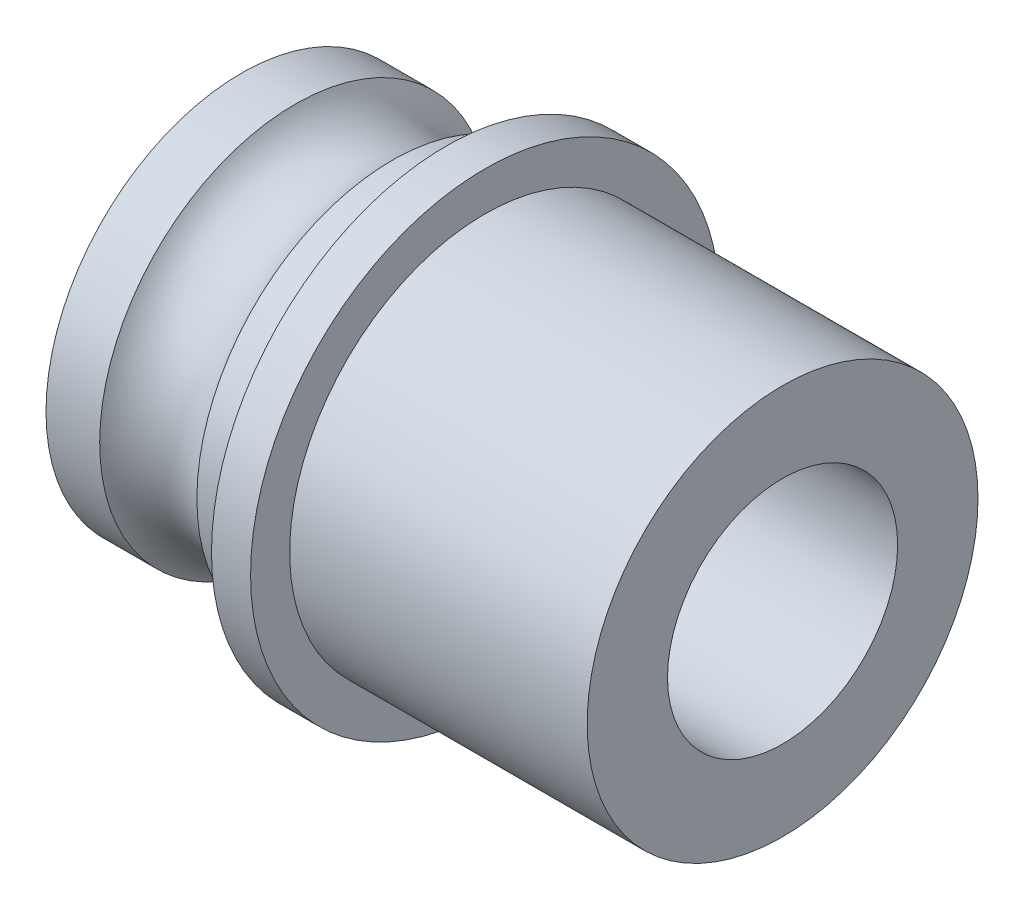
ISO-10303-21;
HEADER;
FILE_DESCRIPTION(('STEP AP214'),'2;1');
FILE_NAME('part.step','',(''),(''),'','','');
FILE_SCHEMA(('AUTOMOTIVE_DESIGN { 1 0 10303 214 1 1 1 1 }'));
ENDSEC;
DATA;
#1=APPLICATION_CONTEXT('core data for automotive mechanical design processes');
#2=APPLICATION_PROTOCOL_DEFINITION('international standard','automotive_design',2000,#1);
#3=PRODUCT_CONTEXT('',#1,'mechanical');
#4=PRODUCT('Part','Part','',(#3));
#5=PRODUCT_RELATED_PRODUCT_CATEGORY('part','',(#4));
#6=PRODUCT_DEFINITION_FORMATION('','',#4);
#7=PRODUCT_DEFINITION_CONTEXT('part definition',#1,'design');
#8=PRODUCT_DEFINITION('design','',#6,#7);
#9=PRODUCT_DEFINITION_SHAPE('','',#8);
#10=(LENGTH_UNIT() NAMED_UNIT(*) SI_UNIT(.MILLI.,.METRE.));
#11=(NAMED_UNIT(*) PLANE_ANGLE_UNIT() SI_UNIT($,.RADIAN.));
#12=(NAMED_UNIT(*) SI_UNIT($,.STERADIAN.) SOLID_ANGLE_UNIT());
#13=UNCERTAINTY_MEASURE_WITH_UNIT(LENGTH_MEASURE(1.E-05),#10,'distance_accuracy_value','');
#14=(GEOMETRIC_REPRESENTATION_CONTEXT(3) GLOBAL_UNCERTAINTY_ASSIGNED_CONTEXT((#13)) GLOBAL_UNIT_ASSIGNED_CONTEXT((#10,
#11,#12)) REPRESENTATION_CONTEXT('',''));
#15=CARTESIAN_POINT('',(0.,0.,0.));
#16=DIRECTION('',(0.,0.,1.));
#17=DIRECTION('',(1.,0.,0.));
#18=AXIS2_PLACEMENT_3D('',#15,#16,#17);
#19=CARTESIAN_POINT('',(14.0654761213164,-4.5,0.));
#20=DIRECTION('',(-1.,0.,0.));
#21=DIRECTION('',(0.,0.,1.));
#22=AXIS2_PLACEMENT_3D('',#19,#20,#21);
#23=CYLINDRICAL_SURFACE('',#22,29.8619289657627);
#24=CARTESIAN_POINT('',(37.1203545429337,-4.5,0.));
#25=DIRECTION('',(-1.,0.,0.));
#26=DIRECTION('',(0.,0.,1.));
#27=AXIS2_PLACEMENT_3D('',#24,#25,#26);
#28=CIRCLE('',#27,29.8619289657627);
#29=CARTESIAN_POINT('',(37.1203545429337,-4.5,29.8619289657627));
#30=VERTEX_POINT('',#29);
#31=EDGE_CURVE('E47',#30,#30,#28,.T.);
#32=ORIENTED_EDGE('',*,*,#31,.F.);
#33=EDGE_LOOP('',(#32));
#34=FACE_BOUND('',#33,.T.);
#35=CARTESIAN_POINT('',(45.3264858004301,-4.5,0.));
#36=DIRECTION('',(1.,0.,0.));
#37=DIRECTION('',(0.,0.,-1.));
#38=AXIS2_PLACEMENT_3D('',#35,#36,#37);
#39=CIRCLE('',#38,29.8619289657627);
#40=CARTESIAN_POINT('',(45.3264858004301,-4.5,-29.8619289657626));
#41=VERTEX_POINT('',#40);
#42=EDGE_CURVE('E10',#41,#41,#39,.T.);
#43=ORIENTED_EDGE('',*,*,#42,.F.);
#44=EDGE_LOOP('',(#43));
#45=FACE_BOUND('',#44,.T.);
#46=ADVANCED_FACE('F38',(#34,#45),#23,.T.);
#47=CARTESIAN_POINT('',(29.6959021698705,-4.5,0.));
#48=DIRECTION('',(-1.,0.,0.));
#49=DIRECTION('',(0.,0.,1.));
#50=AXIS2_PLACEMENT_3D('',#47,#48,#49);
#51=TOROIDAL_SURFACE('',#50,34.1956742333182,8.59673432670477);
#52=CARTESIAN_POINT('',(22.2714497968073,-4.5,0.));
#53=DIRECTION('',(-1.,0.,0.));
#54=DIRECTION('',(0.,0.,1.));
#55=AXIS2_PLACEMENT_3D('',#52,#53,#54);
#56=CIRCLE('',#55,29.8619289657627);
#57=CARTESIAN_POINT('',(22.2714497968073,-4.5,29.8619289657627));
#58=VERTEX_POINT('',#57);
#59=EDGE_CURVE('E52',#58,#58,#56,.T.);
#60=ORIENTED_EDGE('',*,*,#59,.F.);
#61=EDGE_LOOP('',(#60));
#62=FACE_BOUND('',#61,.T.);
#63=ORIENTED_EDGE('',*,*,#31,.T.);
#64=EDGE_LOOP('',(#63));
#65=FACE_BOUND('',#64,.T.);
#66=ADVANCED_FACE('F95',(#62,#65),#51,.F.);
#67=CARTESIAN_POINT('',(14.0654761213164,-4.5,0.));
#68=DIRECTION('',(-1.,0.,0.));
#69=DIRECTION('',(0.,0.,1.));
#70=AXIS2_PLACEMENT_3D('',#67,#68,#69);
#71=CYLINDRICAL_SURFACE('',#70,29.8619289657627);
#72=CARTESIAN_POINT('',(14.0654761213164,-4.5,0.));
#73=DIRECTION('',(-1.,0.,0.));
#74=DIRECTION('',(0.,0.,1.));
#75=AXIS2_PLACEMENT_3D('',#72,#73,#74);
#76=CIRCLE('',#75,29.8619289657627);
#77=CARTESIAN_POINT('',(14.0654761213164,-4.5,29.8619289657627));
#78=VERTEX_POINT('',#77);
#79=EDGE_CURVE('E58',#78,#78,#76,.T.);
#80=ORIENTED_EDGE('',*,*,#79,.F.);
#81=EDGE_LOOP('',(#80));
#82=FACE_BOUND('',#81,.T.);
#83=ORIENTED_EDGE('',*,*,#59,.T.);
#84=EDGE_LOOP('',(#83));
#85=FACE_BOUND('',#84,.T.);
#86=ADVANCED_FACE('F100',(#82,#85),#71,.T.);
#87=CARTESIAN_POINT('',(14.0654761213164,13.0842293046234,0.));
#88=DIRECTION('',(1.,0.,0.));
#89=DIRECTION('',(0.,0.,-1.));
#90=AXIS2_PLACEMENT_3D('',#87,#88,#89);
#91=PLANE('',#90);
#92=CARTESIAN_POINT('',(14.0654761213164,-4.5,0.));
#93=DIRECTION('',(-1.,0.,0.));
#94=DIRECTION('',(0.,0.,1.));
#95=AXIS2_PLACEMENT_3D('',#92,#93,#94);
#96=CIRCLE('',#95,17.5842293046234);
#97=CARTESIAN_POINT('',(14.0654761213164,-4.5,17.5842293046234));
#98=VERTEX_POINT('',#97);
#99=EDGE_CURVE('E62',#98,#98,#96,.T.);
#100=ORIENTED_EDGE('',*,*,#99,.F.);
#101=EDGE_LOOP('',(#100));
#102=FACE_BOUND('',#101,.T.);
#103=ORIENTED_EDGE('',*,*,#79,.T.);
#104=EDGE_LOOP('',(#103));
#105=FACE_BOUND('',#104,.T.);
#106=ADVANCED_FACE('F128',(#102,#105),#91,.F.);
#107=CARTESIAN_POINT('',(45.3264858004301,-4.5,0.));
#108=DIRECTION('',(1.,0.,0.));
#109=DIRECTION('',(0.,0.,-1.));
#110=AXIS2_PLACEMENT_3D('',#107,#108,#109);
#111=PLANE('',#110);
#112=ORIENTED_EDGE('',*,*,#42,.T.);
#113=EDGE_LOOP('',(#112));
#114=FACE_BOUND('',#113,.T.);
#115=CARTESIAN_POINT('',(45.3264858004301,-4.5,0.));
#116=DIRECTION('',(1.,0.,0.));
#117=DIRECTION('',(0.,0.,-1.));
#118=AXIS2_PLACEMENT_3D('',#115,#116,#117);
#119=CIRCLE('',#118,35.8342501876817);
#120=CARTESIAN_POINT('',(45.3264858004301,-4.5,-35.8342501876817));
#121=VERTEX_POINT('',#120);
#122=EDGE_CURVE('E66',#121,#121,#119,.T.);
#123=ORIENTED_EDGE('',*,*,#122,.F.);
#124=EDGE_LOOP('',(#123));
#125=FACE_BOUND('',#124,.T.);
#126=ADVANCED_FACE('F122',(#114,#125),#111,.F.);
#127=CARTESIAN_POINT('',(51.2988070223492,-4.5,0.));
#128=DIRECTION('',(1.,0.,0.));
#129=DIRECTION('',(0.,0.,-1.));
#130=AXIS2_PLACEMENT_3D('',#127,#128,#129);
#131=PLANE('',#130);
#132=CARTESIAN_POINT('',(51.2988070223492,-4.5,0.));
#133=DIRECTION('',(1.,0.,0.));
#134=DIRECTION('',(0.,0.,-1.));
#135=AXIS2_PLACEMENT_3D('',#132,#133,#134);
#136=CIRCLE('',#135,29.8619289657627);
#137=CARTESIAN_POINT('',(51.2988070223492,-4.5,-29.8619289657626));
#138=VERTEX_POINT('',#137);
#139=EDGE_CURVE('E42',#138,#138,#136,.T.);
#140=ORIENTED_EDGE('',*,*,#139,.F.);
#141=EDGE_LOOP('',(#140));
#142=FACE_BOUND('',#141,.T.);
#143=CARTESIAN_POINT('',(51.2988070223492,-4.5,0.));
#144=DIRECTION('',(1.,0.,0.));
#145=DIRECTION('',(0.,0.,-1.));
#146=AXIS2_PLACEMENT_3D('',#143,#144,#145);
#147=CIRCLE('',#146,35.8342501876817);
#148=CARTESIAN_POINT('',(51.2988070223492,-4.5,-35.8342501876817));
#149=VERTEX_POINT('',#148);
#150=EDGE_CURVE('E70',#149,#149,#147,.T.);
#151=ORIENTED_EDGE('',*,*,#150,.T.);
#152=EDGE_LOOP('',(#151));
#153=FACE_BOUND('',#152,.T.);
#154=ADVANCED_FACE('F111',(#142,#153),#131,.T.);
#155=CARTESIAN_POINT('',(51.2988070223492,-4.5,0.));
#156=DIRECTION('',(-1.,0.,0.));
#157=DIRECTION('',(0.,0.,1.));
#158=AXIS2_PLACEMENT_3D('',#155,#156,#157);
#159=CYLINDRICAL_SURFACE('',#158,35.8342501876817);
#160=ORIENTED_EDGE('',*,*,#150,.F.);
#161=EDGE_LOOP('',(#160));
#162=FACE_BOUND('',#161,.T.);
#163=ORIENTED_EDGE('',*,*,#122,.T.);
#164=EDGE_LOOP('',(#163));
#165=FACE_BOUND('',#164,.T.);
#166=ADVANCED_FACE('F106',(#162,#165),#159,.T.);
#167=ORIENTED_EDGE('',*,*,#139,.T.);
#168=EDGE_LOOP('',(#167));
#169=FACE_BOUND('',#168,.T.);
#170=CARTESIAN_POINT('',(96.7624373547729,-4.5,0.));
#171=DIRECTION('',(1.,0.,0.));
#172=DIRECTION('',(0.,0.,-1.));
#173=AXIS2_PLACEMENT_3D('',#170,#171,#172);
#174=CIRCLE('',#173,29.8619289657627);
#175=CARTESIAN_POINT('',(96.7624373547729,-4.5,-29.8619289657627));
#176=VERTEX_POINT('',#175);
#177=EDGE_CURVE('E71',#176,#176,#174,.T.);
#178=ORIENTED_EDGE('',*,*,#177,.F.);
#179=EDGE_LOOP('',(#178));
#180=FACE_BOUND('',#179,.T.);
#181=ADVANCED_FACE('F91',(#169,#180),#23,.T.);
#182=CARTESIAN_POINT('',(14.0654761213164,-4.5,0.));
#183=DIRECTION('',(-1.,0.,0.));
#184=DIRECTION('',(0.,0.,1.));
#185=AXIS2_PLACEMENT_3D('',#182,#183,#184);
#186=CYLINDRICAL_SURFACE('',#185,17.5842293046234);
#187=ORIENTED_EDGE('',*,*,#99,.T.);
#188=EDGE_LOOP('',(#187));
#189=FACE_BOUND('',#188,.T.);
#190=CARTESIAN_POINT('',(96.7624373547729,-4.5,0.));
#191=DIRECTION('',(1.,0.,0.));
#192=DIRECTION('',(0.,0.,-1.));
#193=AXIS2_PLACEMENT_3D('',#190,#191,#192);
#194=CIRCLE('',#193,17.5842293046234);
#195=CARTESIAN_POINT('',(96.7624373547729,-4.5,-17.5842293046234));
#196=VERTEX_POINT('',#195);
#197=EDGE_CURVE('E78',#196,#196,#194,.T.);
#198=ORIENTED_EDGE('',*,*,#197,.T.);
#199=EDGE_LOOP('',(#198));
#200=FACE_BOUND('',#199,.T.);
#201=ADVANCED_FACE('F40',(#189,#200),#186,.F.);
#202=CARTESIAN_POINT('',(96.7624373547729,-4.5,0.));
#203=DIRECTION('',(1.,0.,0.));
#204=DIRECTION('',(0.,0.,-1.));
#205=AXIS2_PLACEMENT_3D('',#202,#203,#204);
#206=PLANE('',#205);
#207=ORIENTED_EDGE('',*,*,#177,.T.);
#208=EDGE_LOOP('',(#207));
#209=FACE_BOUND('',#208,.T.);
#210=ORIENTED_EDGE('',*,*,#197,.F.);
#211=EDGE_LOOP('',(#210));
#212=FACE_BOUND('',#211,.T.);
#213=ADVANCED_FACE('F84',(#209,#212),#206,.T.);
#214=CLOSED_SHELL('',(#46,#66,#86,#106,#126,#154,#166,#181,#201,#213));
#215=MANIFOLD_SOLID_BREP('B2',#214);
#216=ADVANCED_BREP_SHAPE_REPRESENTATION('',(#18,#215),#14);
#217=SHAPE_DEFINITION_REPRESENTATION(#9,#216);
ENDSEC;
END-ISO-10303-21;
